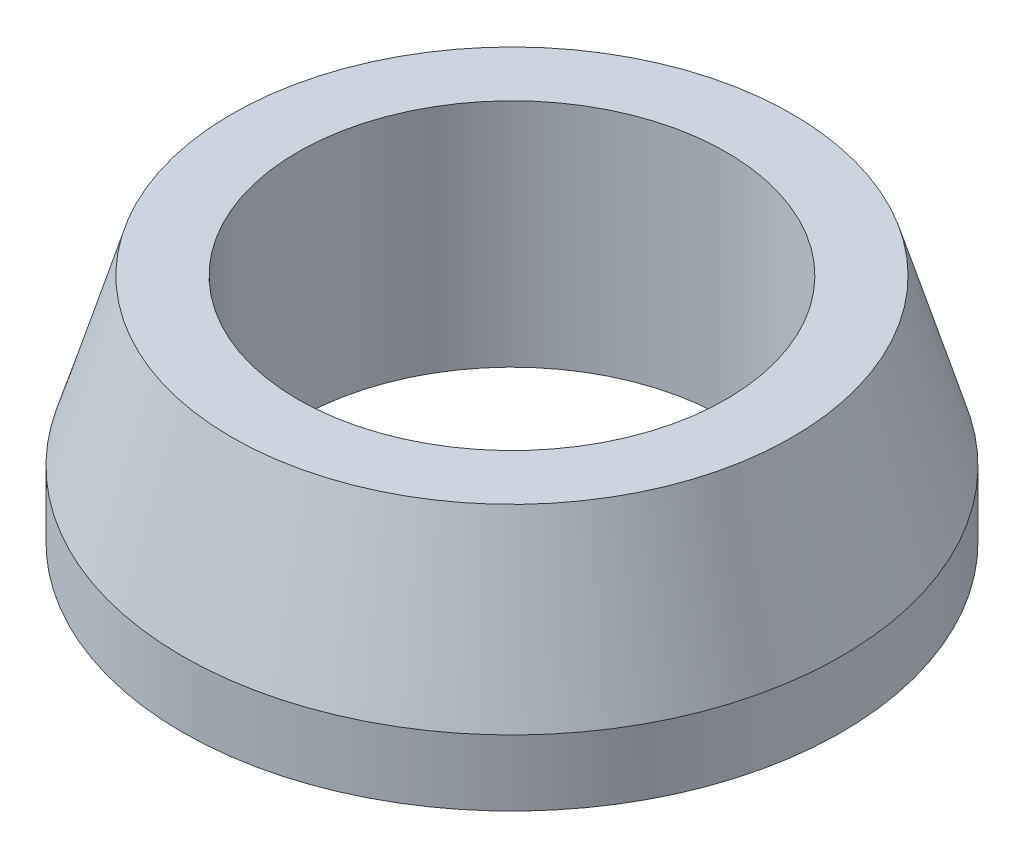
ISO-10303-21;
HEADER;
FILE_DESCRIPTION(('STEP AP214'),'2;1');
FILE_NAME('part.step','',(''),(''),'','','');
FILE_SCHEMA(('AUTOMOTIVE_DESIGN { 1 0 10303 214 1 1 1 1 }'));
ENDSEC;
DATA;
#1=APPLICATION_CONTEXT('core data for automotive mechanical design processes');
#2=APPLICATION_PROTOCOL_DEFINITION('international standard','automotive_design',2000,#1);
#3=PRODUCT_CONTEXT('',#1,'mechanical');
#4=PRODUCT('Part','Part','',(#3));
#5=PRODUCT_RELATED_PRODUCT_CATEGORY('part','',(#4));
#6=PRODUCT_DEFINITION_FORMATION('','',#4);
#7=PRODUCT_DEFINITION_CONTEXT('part definition',#1,'design');
#8=PRODUCT_DEFINITION('design','',#6,#7);
#9=PRODUCT_DEFINITION_SHAPE('','',#8);
#10=(LENGTH_UNIT() NAMED_UNIT(*) SI_UNIT(.MILLI.,.METRE.));
#11=(NAMED_UNIT(*) PLANE_ANGLE_UNIT() SI_UNIT($,.RADIAN.));
#12=(NAMED_UNIT(*) SI_UNIT($,.STERADIAN.) SOLID_ANGLE_UNIT());
#13=UNCERTAINTY_MEASURE_WITH_UNIT(LENGTH_MEASURE(1.E-05),#10,'distance_accuracy_value','');
#14=(GEOMETRIC_REPRESENTATION_CONTEXT(3) GLOBAL_UNCERTAINTY_ASSIGNED_CONTEXT((#13)) GLOBAL_UNIT_ASSIGNED_CONTEXT((#10,
#11,#12)) REPRESENTATION_CONTEXT('',''));
#15=CARTESIAN_POINT('',(0.,0.,0.));
#16=DIRECTION('',(0.,0.,1.));
#17=DIRECTION('',(1.,0.,0.));
#18=AXIS2_PLACEMENT_3D('',#15,#16,#17);
#19=CARTESIAN_POINT('',(0.,-7.,0.));
#20=DIRECTION('',(0.,1.,0.));
#21=DIRECTION('',(0.,0.,1.));
#22=AXIS2_PLACEMENT_3D('',#19,#20,#21);
#23=CYLINDRICAL_SURFACE('',#22,10.);
#24=CARTESIAN_POINT('',(0.,-7.,0.));
#25=DIRECTION('',(0.,1.,0.));
#26=DIRECTION('',(0.,0.,1.));
#27=AXIS2_PLACEMENT_3D('',#24,#25,#26);
#28=CIRCLE('',#27,10.);
#29=CARTESIAN_POINT('',(0.,-7.,10.));
#30=VERTEX_POINT('',#29);
#31=EDGE_CURVE('E11',#30,#30,#28,.T.);
#32=ORIENTED_EDGE('',*,*,#31,.T.);
#33=EDGE_LOOP('',(#32));
#34=FACE_BOUND('',#33,.T.);
#35=CARTESIAN_POINT('',(0.,-5.,0.));
#36=DIRECTION('',(0.,-1.,0.));
#37=DIRECTION('',(0.,0.,-1.));
#38=AXIS2_PLACEMENT_3D('',#35,#36,#37);
#39=CIRCLE('',#38,10.);
#40=CARTESIAN_POINT('',(0.,-5.,-10.));
#41=VERTEX_POINT('',#40);
#42=EDGE_CURVE('E45',#41,#41,#39,.F.);
#43=ORIENTED_EDGE('',*,*,#42,.F.);
#44=EDGE_LOOP('',(#43));
#45=FACE_BOUND('',#44,.T.);
#46=ADVANCED_FACE('F38',(#34,#45),#23,.T.);
#47=CARTESIAN_POINT('',(0.,-7.,0.));
#48=DIRECTION('',(0.,1.,0.));
#49=DIRECTION('',(0.,0.,1.));
#50=AXIS2_PLACEMENT_3D('',#47,#48,#49);
#51=PLANE('',#50);
#52=CARTESIAN_POINT('',(0.,-7.,0.));
#53=DIRECTION('',(0.,1.,0.));
#54=DIRECTION('',(0.,0.,1.));
#55=AXIS2_PLACEMENT_3D('',#52,#53,#54);
#56=CIRCLE('',#55,6.5);
#57=CARTESIAN_POINT('',(0.,-7.,6.5));
#58=VERTEX_POINT('',#57);
#59=EDGE_CURVE('E50',#58,#58,#56,.T.);
#60=ORIENTED_EDGE('',*,*,#59,.T.);
#61=EDGE_LOOP('',(#60));
#62=FACE_BOUND('',#61,.T.);
#63=ORIENTED_EDGE('',*,*,#31,.F.);
#64=EDGE_LOOP('',(#63));
#65=FACE_BOUND('',#64,.T.);
#66=ADVANCED_FACE('F81',(#62,#65),#51,.F.);
#67=CARTESIAN_POINT('',(0.,-7.,0.));
#68=DIRECTION('',(0.,1.,0.));
#69=DIRECTION('',(0.,0.,1.));
#70=AXIS2_PLACEMENT_3D('',#67,#68,#69);
#71=CYLINDRICAL_SURFACE('',#70,6.5);
#72=ORIENTED_EDGE('',*,*,#59,.F.);
#73=EDGE_LOOP('',(#72));
#74=FACE_BOUND('',#73,.T.);
#75=CARTESIAN_POINT('',(0.,0.,0.));
#76=DIRECTION('',(0.,1.,0.));
#77=DIRECTION('',(0.,0.,1.));
#78=AXIS2_PLACEMENT_3D('',#75,#76,#77);
#79=CIRCLE('',#78,6.5);
#80=CARTESIAN_POINT('',(0.,0.,6.5));
#81=VERTEX_POINT('',#80);
#82=EDGE_CURVE('E41',#81,#81,#79,.T.);
#83=ORIENTED_EDGE('',*,*,#82,.T.);
#84=EDGE_LOOP('',(#83));
#85=FACE_BOUND('',#84,.T.);
#86=ADVANCED_FACE('F77',(#74,#85),#71,.F.);
#87=CARTESIAN_POINT('',(0.,0.,0.));
#88=DIRECTION('',(0.,1.,0.));
#89=DIRECTION('',(0.,0.,1.));
#90=AXIS2_PLACEMENT_3D('',#87,#88,#89);
#91=PLANE('',#90);
#92=ORIENTED_EDGE('',*,*,#82,.F.);
#93=EDGE_LOOP('',(#92));
#94=FACE_BOUND('',#93,.T.);
#95=CARTESIAN_POINT('',(0.,0.,0.));
#96=DIRECTION('',(0.,1.,0.));
#97=DIRECTION('',(0.,0.,1.));
#98=AXIS2_PLACEMENT_3D('',#95,#96,#97);
#99=CIRCLE('',#98,8.5);
#100=CARTESIAN_POINT('',(0.,0.,8.5));
#101=VERTEX_POINT('',#100);
#102=EDGE_CURVE('E56',#101,#101,#99,.T.);
#103=ORIENTED_EDGE('',*,*,#102,.T.);
#104=EDGE_LOOP('',(#103));
#105=FACE_BOUND('',#104,.T.);
#106=ADVANCED_FACE('F66',(#94,#105),#91,.T.);
#107=CARTESIAN_POINT('',(0.,0.,0.));
#108=DIRECTION('',(0.,-1.,0.));
#109=DIRECTION('',(0.,0.,-1.));
#110=AXIS2_PLACEMENT_3D('',#107,#108,#109);
#111=CONICAL_SURFACE('',#110,8.5,0.291456794477867);
#112=ORIENTED_EDGE('',*,*,#42,.T.);
#113=EDGE_LOOP('',(#112));
#114=FACE_BOUND('',#113,.T.);
#115=ORIENTED_EDGE('',*,*,#102,.F.);
#116=EDGE_LOOP('',(#115));
#117=FACE_BOUND('',#116,.T.);
#118=ADVANCED_FACE('F76',(#114,#117),#111,.T.);
#119=CLOSED_SHELL('',(#46,#66,#86,#106,#118));
#120=MANIFOLD_SOLID_BREP('B2',#119);
#121=ADVANCED_BREP_SHAPE_REPRESENTATION('',(#18,#120),#14);
#122=SHAPE_DEFINITION_REPRESENTATION(#9,#121);
ENDSEC;
END-ISO-10303-21;
